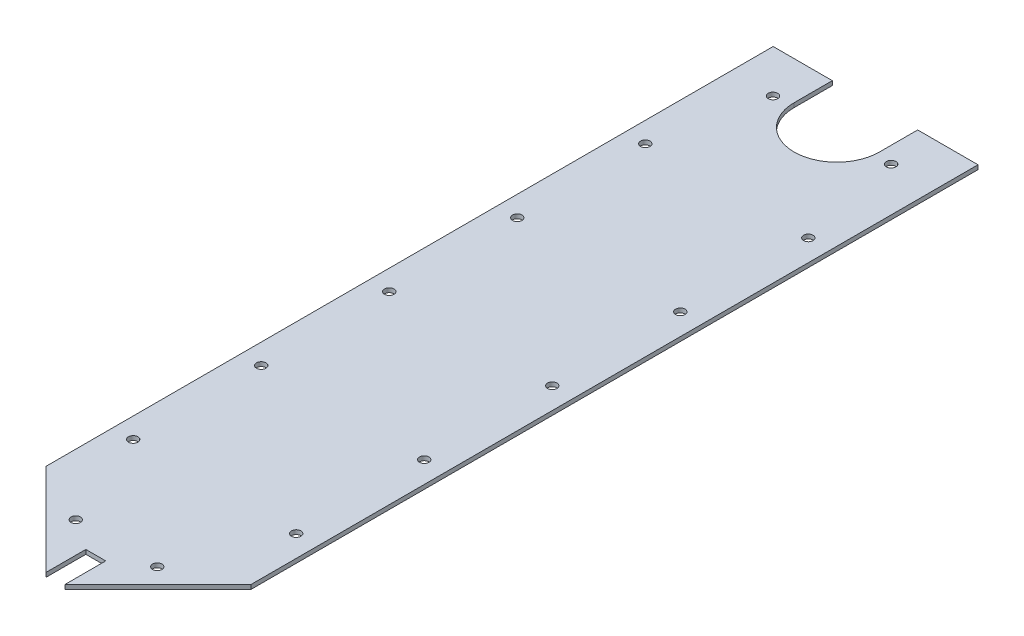
ISO-10303-21;
HEADER;
FILE_DESCRIPTION(('STEP AP214'),'2;1');
FILE_NAME('part.step','',(''),(''),'','','');
FILE_SCHEMA(('AUTOMOTIVE_DESIGN { 1 0 10303 214 1 1 1 1 }'));
ENDSEC;
DATA;
#1=APPLICATION_CONTEXT('core data for automotive mechanical design processes');
#2=APPLICATION_PROTOCOL_DEFINITION('international standard','automotive_design',2000,#1);
#3=PRODUCT_CONTEXT('',#1,'mechanical');
#4=PRODUCT('Part','Part','',(#3));
#5=PRODUCT_RELATED_PRODUCT_CATEGORY('part','',(#4));
#6=PRODUCT_DEFINITION_FORMATION('','',#4);
#7=PRODUCT_DEFINITION_CONTEXT('part definition',#1,'design');
#8=PRODUCT_DEFINITION('design','',#6,#7);
#9=PRODUCT_DEFINITION_SHAPE('','',#8);
#10=(LENGTH_UNIT() NAMED_UNIT(*) SI_UNIT(.MILLI.,.METRE.));
#11=(NAMED_UNIT(*) PLANE_ANGLE_UNIT() SI_UNIT($,.RADIAN.));
#12=(NAMED_UNIT(*) SI_UNIT($,.STERADIAN.) SOLID_ANGLE_UNIT());
#13=UNCERTAINTY_MEASURE_WITH_UNIT(LENGTH_MEASURE(1.E-05),#10,'distance_accuracy_value','');
#14=(GEOMETRIC_REPRESENTATION_CONTEXT(3) GLOBAL_UNCERTAINTY_ASSIGNED_CONTEXT((#13)) GLOBAL_UNIT_ASSIGNED_CONTEXT((#10,
#11,#12)) REPRESENTATION_CONTEXT('',''));
#15=CARTESIAN_POINT('',(0.,0.,0.));
#16=DIRECTION('',(0.,0.,1.));
#17=DIRECTION('',(1.,0.,0.));
#18=AXIS2_PLACEMENT_3D('',#15,#16,#17);
#19=CARTESIAN_POINT('',(0.,3.,-264.934819645511));
#20=DIRECTION('',(0.,-1.,0.));
#21=DIRECTION('',(0.,0.,-1.));
#22=AXIS2_PLACEMENT_3D('',#19,#20,#21);
#23=CYLINDRICAL_SURFACE('',#22,30.0057645191929);
#24=CARTESIAN_POINT('',(0.,0.,-264.934819645511));
#25=DIRECTION('',(0.,-1.,0.));
#26=DIRECTION('',(0.,0.,1.));
#27=AXIS2_PLACEMENT_3D('',#24,#25,#26);
#28=CIRCLE('',#27,30.0057645191929);
#29=CARTESIAN_POINT('',(30.0057645191929,0.,-264.934819645511));
#30=VERTEX_POINT('',#29);
#31=CARTESIAN_POINT('',(-30.0057645191929,0.,-264.934819645511));
#32=VERTEX_POINT('',#31);
#33=EDGE_CURVE('E151',#30,#32,#28,.T.);
#34=ORIENTED_EDGE('',*,*,#33,.T.);
#35=DIRECTION('',(0.,-1.,0.));
#36=VECTOR('',#35,1.);
#37=CARTESIAN_POINT('',(-30.0057645191929,3.,-264.934819645511));
#38=LINE('',#37,#36);
#39=CARTESIAN_POINT('',(-30.0057645191929,3.,-264.934819645511));
#40=VERTEX_POINT('',#39);
#41=EDGE_CURVE('E11',#40,#32,#38,.T.);
#42=ORIENTED_EDGE('',*,*,#41,.F.);
#43=CARTESIAN_POINT('',(0.,3.,-264.934819645511));
#44=DIRECTION('',(0.,-1.,0.));
#45=DIRECTION('',(0.,0.,1.));
#46=AXIS2_PLACEMENT_3D('',#43,#44,#45);
#47=CIRCLE('',#46,30.0057645191929);
#48=CARTESIAN_POINT('',(30.0057645191929,3.,-264.934819645511));
#49=VERTEX_POINT('',#48);
#50=EDGE_CURVE('E170',#49,#40,#47,.T.);
#51=ORIENTED_EDGE('',*,*,#50,.F.);
#52=DIRECTION('',(0.,-1.,0.));
#53=VECTOR('',#52,1.);
#54=CARTESIAN_POINT('',(30.0057645191929,3.,-264.934819645511));
#55=LINE('',#54,#53);
#56=EDGE_CURVE('E147',#49,#30,#55,.T.);
#57=ORIENTED_EDGE('',*,*,#56,.T.);
#58=EDGE_LOOP('',(#34,#42,#51,#57));
#59=FACE_BOUND('',#58,.T.);
#60=ADVANCED_FACE('F41',(#59),#23,.F.);
#61=CARTESIAN_POINT('',(-30.0057645191929,3.,-264.934819645511));
#62=DIRECTION('',(-1.,0.,0.));
#63=DIRECTION('',(0.,0.,1.));
#64=AXIS2_PLACEMENT_3D('',#61,#62,#63);
#65=PLANE('',#64);
#66=DIRECTION('',(0.,0.,-1.));
#67=VECTOR('',#66,1.);
#68=CARTESIAN_POINT('',(-30.0057645191929,0.,-264.934819645511));
#69=LINE('',#68,#67);
#70=CARTESIAN_POINT('',(-30.0057645191929,0.,-291.800526165511));
#71=VERTEX_POINT('',#70);
#72=EDGE_CURVE('E154',#32,#71,#69,.T.);
#73=ORIENTED_EDGE('',*,*,#72,.T.);
#74=DIRECTION('',(0.,-1.,0.));
#75=VECTOR('',#74,1.);
#76=CARTESIAN_POINT('',(-30.0057645191929,3.,-291.800526165511));
#77=LINE('',#76,#75);
#78=CARTESIAN_POINT('',(-30.0057645191929,3.,-291.800526165511));
#79=VERTEX_POINT('',#78);
#80=EDGE_CURVE('E48',#79,#71,#77,.T.);
#81=ORIENTED_EDGE('',*,*,#80,.F.);
#82=DIRECTION('',(0.,0.,-1.));
#83=VECTOR('',#82,1.);
#84=CARTESIAN_POINT('',(-30.0057645191929,3.,-264.934819645511));
#85=LINE('',#84,#83);
#86=EDGE_CURVE('E105',#40,#79,#85,.T.);
#87=ORIENTED_EDGE('',*,*,#86,.F.);
#88=ORIENTED_EDGE('',*,*,#41,.T.);
#89=EDGE_LOOP('',(#73,#81,#87,#88));
#90=FACE_BOUND('',#89,.T.);
#91=ADVANCED_FACE('F354',(#90),#65,.F.);
#92=CARTESIAN_POINT('',(-71.592001124657,3.,-291.800526165511));
#93=DIRECTION('',(0.,0.,1.));
#94=DIRECTION('',(1.,0.,0.));
#95=AXIS2_PLACEMENT_3D('',#92,#93,#94);
#96=PLANE('',#95);
#97=DIRECTION('',(-1.,0.,0.));
#98=VECTOR('',#97,1.);
#99=CARTESIAN_POINT('',(-71.592001124657,0.,-291.800526165511));
#100=LINE('',#99,#98);
#101=CARTESIAN_POINT('',(-71.592001124657,0.,-291.800526165511));
#102=VERTEX_POINT('',#101);
#103=EDGE_CURVE('E157',#71,#102,#100,.T.);
#104=ORIENTED_EDGE('',*,*,#103,.T.);
#105=DIRECTION('',(0.,-1.,0.));
#106=VECTOR('',#105,1.);
#107=CARTESIAN_POINT('',(-71.592001124657,3.,-291.800526165511));
#108=LINE('',#107,#106);
#109=CARTESIAN_POINT('',(-71.592001124657,3.,-291.800526165511));
#110=VERTEX_POINT('',#109);
#111=EDGE_CURVE('E177',#110,#102,#108,.T.);
#112=ORIENTED_EDGE('',*,*,#111,.F.);
#113=DIRECTION('',(-1.,0.,0.));
#114=VECTOR('',#113,1.);
#115=CARTESIAN_POINT('',(-71.592001124657,3.,-291.800526165511));
#116=LINE('',#115,#114);
#117=EDGE_CURVE('E185',#79,#110,#116,.T.);
#118=ORIENTED_EDGE('',*,*,#117,.F.);
#119=ORIENTED_EDGE('',*,*,#80,.T.);
#120=EDGE_LOOP('',(#104,#112,#118,#119));
#121=FACE_BOUND('',#120,.T.);
#122=ADVANCED_FACE('F183',(#121),#96,.F.);
#123=CARTESIAN_POINT('',(-71.592001124657,3.,-291.800526165511));
#124=DIRECTION('',(1.,0.,0.));
#125=DIRECTION('',(0.,0.,-1.));
#126=AXIS2_PLACEMENT_3D('',#123,#124,#125);
#127=PLANE('',#126);
#128=DIRECTION('',(0.,0.,1.));
#129=VECTOR('',#128,1.);
#130=CARTESIAN_POINT('',(-71.592001124657,0.,-291.800526165511));
#131=LINE('',#130,#129);
#132=CARTESIAN_POINT('',(-71.592001124657,0.,219.373421964122));
#133=VERTEX_POINT('',#132);
#134=EDGE_CURVE('E159',#102,#133,#131,.T.);
#135=ORIENTED_EDGE('',*,*,#134,.T.);
#136=DIRECTION('',(0.,-1.,0.));
#137=VECTOR('',#136,1.);
#138=CARTESIAN_POINT('',(-71.592001124657,3.,219.373421964122));
#139=LINE('',#138,#137);
#140=CARTESIAN_POINT('',(-71.592001124657,3.,219.373421964122));
#141=VERTEX_POINT('',#140);
#142=EDGE_CURVE('E174',#141,#133,#139,.T.);
#143=ORIENTED_EDGE('',*,*,#142,.F.);
#144=DIRECTION('',(0.,0.,1.));
#145=VECTOR('',#144,1.);
#146=CARTESIAN_POINT('',(-71.592001124657,3.,-291.800526165511));
#147=LINE('',#146,#145);
#148=EDGE_CURVE('E203',#110,#141,#147,.T.);
#149=ORIENTED_EDGE('',*,*,#148,.F.);
#150=ORIENTED_EDGE('',*,*,#111,.T.);
#151=EDGE_LOOP('',(#135,#143,#149,#150));
#152=FACE_BOUND('',#151,.T.);
#153=ADVANCED_FACE('F194',(#152),#127,.F.);
#154=CARTESIAN_POINT('',(-71.592001124657,3.,219.373421964122));
#155=DIRECTION('',(0.707106781186547,0.,-0.707106781186548));
#156=DIRECTION('',(-0.707106781186548,0.,-0.707106781186547));
#157=AXIS2_PLACEMENT_3D('',#154,#155,#156);
#158=PLANE('',#157);
#159=DIRECTION('',(0.707106781186548,0.,0.707106781186547));
#160=VECTOR('',#159,1.);
#161=CARTESIAN_POINT('',(-71.592001124657,0.,219.373421964122));
#162=LINE('',#161,#160);
#163=CARTESIAN_POINT('',(-7.00000000000002,0.,283.965423088779));
#164=VERTEX_POINT('',#163);
#165=EDGE_CURVE('E161',#133,#164,#162,.T.);
#166=ORIENTED_EDGE('',*,*,#165,.T.);
#167=DIRECTION('',(0.,1.,0.));
#168=VECTOR('',#167,1.);
#169=CARTESIAN_POINT('',(-7.00000000000002,0.,283.965423088779));
#170=LINE('',#169,#168);
#171=CARTESIAN_POINT('',(-7.00000000000002,3.,283.965423088779));
#172=VERTEX_POINT('',#171);
#173=EDGE_CURVE('E155',#164,#172,#170,.T.);
#174=ORIENTED_EDGE('',*,*,#173,.T.);
#175=DIRECTION('',(0.707106781186548,0.,0.707106781186547));
#176=VECTOR('',#175,1.);
#177=CARTESIAN_POINT('',(-71.592001124657,3.,219.373421964122));
#178=LINE('',#177,#176);
#179=EDGE_CURVE('E201',#141,#172,#178,.T.);
#180=ORIENTED_EDGE('',*,*,#179,.F.);
#181=ORIENTED_EDGE('',*,*,#142,.T.);
#182=EDGE_LOOP('',(#166,#174,#180,#181));
#183=FACE_BOUND('',#182,.T.);
#184=ADVANCED_FACE('F198',(#183),#158,.F.);
#185=CARTESIAN_POINT('',(0.408149385343075,3.,291.373572474122));
#186=DIRECTION('',(-0.707106781186547,0.,-0.707106781186548));
#187=DIRECTION('',(-0.707106781186548,0.,0.707106781186547));
#188=AXIS2_PLACEMENT_3D('',#185,#186,#187);
#189=PLANE('',#188);
#190=DIRECTION('',(0.707106781186548,0.,-0.707106781186547));
#191=VECTOR('',#190,1.);
#192=CARTESIAN_POINT('',(0.408149385343075,3.,291.373572474122));
#193=LINE('',#192,#191);
#194=CARTESIAN_POINT('',(6.99999999999997,3.,284.781721859465));
#195=VERTEX_POINT('',#194);
#196=CARTESIAN_POINT('',(72.408299895343,3.,219.373421964122));
#197=VERTEX_POINT('',#196);
#198=EDGE_CURVE('E130',#195,#197,#193,.T.);
#199=ORIENTED_EDGE('',*,*,#198,.F.);
#200=DIRECTION('',(0.,1.,0.));
#201=VECTOR('',#200,1.);
#202=CARTESIAN_POINT('',(6.99999999999997,0.,284.781721859465));
#203=LINE('',#202,#201);
#204=CARTESIAN_POINT('',(6.99999999999997,0.,284.781721859465));
#205=VERTEX_POINT('',#204);
#206=EDGE_CURVE('E210',#205,#195,#203,.T.);
#207=ORIENTED_EDGE('',*,*,#206,.F.);
#208=DIRECTION('',(0.707106781186548,0.,-0.707106781186547));
#209=VECTOR('',#208,1.);
#210=CARTESIAN_POINT('',(0.408149385343075,0.,291.373572474122));
#211=LINE('',#210,#209);
#212=CARTESIAN_POINT('',(72.408299895343,0.,219.373421964122));
#213=VERTEX_POINT('',#212);
#214=EDGE_CURVE('E164',#205,#213,#211,.T.);
#215=ORIENTED_EDGE('',*,*,#214,.T.);
#216=DIRECTION('',(0.,-1.,0.));
#217=VECTOR('',#216,1.);
#218=CARTESIAN_POINT('',(72.408299895343,3.,219.373421964122));
#219=LINE('',#218,#217);
#220=EDGE_CURVE('E142',#197,#213,#219,.T.);
#221=ORIENTED_EDGE('',*,*,#220,.F.);
#222=EDGE_LOOP('',(#199,#207,#215,#221));
#223=FACE_BOUND('',#222,.T.);
#224=ADVANCED_FACE('F372',(#223),#189,.F.);
#225=CARTESIAN_POINT('',(72.408299895343,3.,219.373421964122));
#226=DIRECTION('',(-1.,0.,0.));
#227=DIRECTION('',(0.,0.,1.));
#228=AXIS2_PLACEMENT_3D('',#225,#226,#227);
#229=PLANE('',#228);
#230=DIRECTION('',(0.,0.,-1.));
#231=VECTOR('',#230,1.);
#232=CARTESIAN_POINT('',(72.408299895343,0.,219.373421964122));
#233=LINE('',#232,#231);
#234=CARTESIAN_POINT('',(72.408299895343,0.,-291.800526165512));
#235=VERTEX_POINT('',#234);
#236=EDGE_CURVE('E139',#213,#235,#233,.T.);
#237=ORIENTED_EDGE('',*,*,#236,.T.);
#238=DIRECTION('',(0.,-1.,0.));
#239=VECTOR('',#238,1.);
#240=CARTESIAN_POINT('',(72.408299895343,3.,-291.800526165512));
#241=LINE('',#240,#239);
#242=CARTESIAN_POINT('',(72.408299895343,3.,-291.800526165512));
#243=VERTEX_POINT('',#242);
#244=EDGE_CURVE('E136',#243,#235,#241,.T.);
#245=ORIENTED_EDGE('',*,*,#244,.F.);
#246=DIRECTION('',(0.,0.,-1.));
#247=VECTOR('',#246,1.);
#248=CARTESIAN_POINT('',(72.408299895343,3.,219.373421964122));
#249=LINE('',#248,#247);
#250=EDGE_CURVE('E121',#197,#243,#249,.T.);
#251=ORIENTED_EDGE('',*,*,#250,.F.);
#252=ORIENTED_EDGE('',*,*,#220,.T.);
#253=EDGE_LOOP('',(#237,#245,#251,#252));
#254=FACE_BOUND('',#253,.T.);
#255=ADVANCED_FACE('F137',(#254),#229,.F.);
#256=CARTESIAN_POINT('',(30.0057645191929,3.,-291.800526165512));
#257=DIRECTION('',(0.,0.,1.));
#258=DIRECTION('',(1.,0.,0.));
#259=AXIS2_PLACEMENT_3D('',#256,#257,#258);
#260=PLANE('',#259);
#261=DIRECTION('',(-1.,0.,0.));
#262=VECTOR('',#261,1.);
#263=CARTESIAN_POINT('',(30.0057645191929,0.,-291.800526165512));
#264=LINE('',#263,#262);
#265=CARTESIAN_POINT('',(30.0057645191929,0.,-291.800526165512));
#266=VERTEX_POINT('',#265);
#267=EDGE_CURVE('E167',#235,#266,#264,.T.);
#268=ORIENTED_EDGE('',*,*,#267,.T.);
#269=DIRECTION('',(0.,-1.,0.));
#270=VECTOR('',#269,1.);
#271=CARTESIAN_POINT('',(30.0057645191929,3.,-291.800526165512));
#272=LINE('',#271,#270);
#273=CARTESIAN_POINT('',(30.0057645191929,3.,-291.800526165512));
#274=VERTEX_POINT('',#273);
#275=EDGE_CURVE('E143',#274,#266,#272,.T.);
#276=ORIENTED_EDGE('',*,*,#275,.F.);
#277=DIRECTION('',(-1.,0.,0.));
#278=VECTOR('',#277,1.);
#279=CARTESIAN_POINT('',(30.0057645191929,3.,-291.800526165512));
#280=LINE('',#279,#278);
#281=EDGE_CURVE('E126',#243,#274,#280,.T.);
#282=ORIENTED_EDGE('',*,*,#281,.F.);
#283=ORIENTED_EDGE('',*,*,#244,.T.);
#284=EDGE_LOOP('',(#268,#276,#282,#283));
#285=FACE_BOUND('',#284,.T.);
#286=ADVANCED_FACE('F145',(#285),#260,.F.);
#287=CARTESIAN_POINT('',(30.0057645191929,3.,-264.934819645511));
#288=DIRECTION('',(1.,0.,0.));
#289=DIRECTION('',(0.,0.,-1.));
#290=AXIS2_PLACEMENT_3D('',#287,#288,#289);
#291=PLANE('',#290);
#292=DIRECTION('',(0.,0.,1.));
#293=VECTOR('',#292,1.);
#294=CARTESIAN_POINT('',(30.0057645191929,0.,-264.934819645511));
#295=LINE('',#294,#293);
#296=EDGE_CURVE('E97',#266,#30,#295,.T.);
#297=ORIENTED_EDGE('',*,*,#296,.T.);
#298=ORIENTED_EDGE('',*,*,#56,.F.);
#299=DIRECTION('',(0.,0.,1.));
#300=VECTOR('',#299,1.);
#301=CARTESIAN_POINT('',(30.0057645191929,3.,-264.934819645511));
#302=LINE('',#301,#300);
#303=EDGE_CURVE('E64',#274,#49,#302,.T.);
#304=ORIENTED_EDGE('',*,*,#303,.F.);
#305=ORIENTED_EDGE('',*,*,#275,.T.);
#306=EDGE_LOOP('',(#297,#298,#304,#305));
#307=FACE_BOUND('',#306,.T.);
#308=ADVANCED_FACE('F323',(#307),#291,.F.);
#309=CARTESIAN_POINT('',(0.,3.,-264.934819645511));
#310=DIRECTION('',(0.,1.,0.));
#311=DIRECTION('',(0.,0.,1.));
#312=AXIS2_PLACEMENT_3D('',#309,#310,#311);
#313=PLANE('',#312);
#314=CARTESIAN_POINT('',(-41.537257894065,3.,-261.609819635512));
#315=DIRECTION('',(0.,1.,0.));
#316=DIRECTION('',(0.,0.,-1.));
#317=AXIS2_PLACEMENT_3D('',#314,#315,#316);
#318=CIRCLE('',#317,3.32500000000001);
#319=CARTESIAN_POINT('',(-41.537257894065,3.,-264.934819635512));
#320=VERTEX_POINT('',#319);
#321=EDGE_CURVE('E257',#320,#320,#318,.T.);
#322=ORIENTED_EDGE('',*,*,#321,.F.);
#323=EDGE_LOOP('',(#322));
#324=FACE_BOUND('',#323,.T.);
#325=CARTESIAN_POINT('',(-57.3001505100004,3.,-97.6273018912213));
#326=DIRECTION('',(0.,1.,0.));
#327=DIRECTION('',(0.,0.,1.));
#328=AXIS2_PLACEMENT_3D('',#325,#326,#327);
#329=CIRCLE('',#328,3.32500000000001);
#330=CARTESIAN_POINT('',(-57.3001505100004,3.,-94.3023018912213));
#331=VERTEX_POINT('',#330);
#332=EDGE_CURVE('E268',#331,#331,#329,.T.);
#333=ORIENTED_EDGE('',*,*,#332,.F.);
#334=EDGE_LOOP('',(#333));
#335=FACE_BOUND('',#334,.T.);
#336=CARTESIAN_POINT('',(-57.3001505100007,3.,-187.627301891221));
#337=DIRECTION('',(0.,1.,0.));
#338=DIRECTION('',(0.,0.,1.));
#339=AXIS2_PLACEMENT_3D('',#336,#337,#338);
#340=CIRCLE('',#339,3.325);
#341=CARTESIAN_POINT('',(-57.3001505100007,3.,-184.302301891221));
#342=VERTEX_POINT('',#341);
#343=EDGE_CURVE('E269',#342,#342,#340,.T.);
#344=ORIENTED_EDGE('',*,*,#343,.F.);
#345=EDGE_LOOP('',(#344));
#346=FACE_BOUND('',#345,.T.);
#347=CARTESIAN_POINT('',(57.3001505100007,3.,-187.627301891221));
#348=DIRECTION('',(0.,1.,0.));
#349=DIRECTION('',(0.,0.,-1.));
#350=AXIS2_PLACEMENT_3D('',#347,#348,#349);
#351=CIRCLE('',#350,3.325);
#352=CARTESIAN_POINT('',(57.3001505100007,3.,-190.952301891221));
#353=VERTEX_POINT('',#352);
#354=EDGE_CURVE('E280',#353,#353,#351,.T.);
#355=ORIENTED_EDGE('',*,*,#354,.F.);
#356=EDGE_LOOP('',(#355));
#357=FACE_BOUND('',#356,.T.);
#358=CARTESIAN_POINT('',(41.537257894065,3.,-261.609819635512));
#359=DIRECTION('',(0.,1.,0.));
#360=DIRECTION('',(0.,0.,1.));
#361=AXIS2_PLACEMENT_3D('',#358,#359,#360);
#362=CIRCLE('',#361,3.32500000000001);
#363=CARTESIAN_POINT('',(41.537257894065,3.,-258.284819635512));
#364=VERTEX_POINT('',#363);
#365=EDGE_CURVE('E238',#364,#364,#362,.T.);
#366=ORIENTED_EDGE('',*,*,#365,.F.);
#367=EDGE_LOOP('',(#366));
#368=FACE_BOUND('',#367,.T.);
#369=CARTESIAN_POINT('',(-57.3001505100001,3.,172.372698108779));
#370=DIRECTION('',(0.,1.,0.));
#371=DIRECTION('',(0.,0.,1.));
#372=AXIS2_PLACEMENT_3D('',#369,#370,#371);
#373=CIRCLE('',#372,3.325);
#374=CARTESIAN_POINT('',(-57.3001505100001,3.,175.697698108779));
#375=VERTEX_POINT('',#374);
#376=EDGE_CURVE('E244',#375,#375,#373,.T.);
#377=ORIENTED_EDGE('',*,*,#376,.F.);
#378=EDGE_LOOP('',(#377));
#379=FACE_BOUND('',#378,.T.);
#380=CARTESIAN_POINT('',(-57.3001505100004,3.,82.3726981087787));
#381=DIRECTION('',(0.,1.,0.));
#382=DIRECTION('',(0.,0.,1.));
#383=AXIS2_PLACEMENT_3D('',#380,#381,#382);
#384=CIRCLE('',#383,3.32500000000001);
#385=CARTESIAN_POINT('',(-57.3001505100004,3.,85.6976981087787));
#386=VERTEX_POINT('',#385);
#387=EDGE_CURVE('E245',#386,#386,#384,.T.);
#388=ORIENTED_EDGE('',*,*,#387,.F.);
#389=EDGE_LOOP('',(#388));
#390=FACE_BOUND('',#389,.T.);
#391=CARTESIAN_POINT('',(-57.3001505100001,3.,-7.62730189122128));
#392=DIRECTION('',(0.,1.,0.));
#393=DIRECTION('',(0.,0.,1.));
#394=AXIS2_PLACEMENT_3D('',#391,#392,#393);
#395=CIRCLE('',#394,3.325);
#396=CARTESIAN_POINT('',(-57.3001505100001,3.,-4.30230189122128));
#397=VERTEX_POINT('',#396);
#398=EDGE_CURVE('E256',#397,#397,#395,.T.);
#399=ORIENTED_EDGE('',*,*,#398,.F.);
#400=EDGE_LOOP('',(#399));
#401=FACE_BOUND('',#400,.T.);
#402=CARTESIAN_POINT('',(57.3001505100001,3.,-7.62730189122128));
#403=DIRECTION('',(0.,1.,0.));
#404=DIRECTION('',(0.,0.,-1.));
#405=AXIS2_PLACEMENT_3D('',#402,#403,#404);
#406=CIRCLE('',#405,3.325);
#407=CARTESIAN_POINT('',(57.3001505100001,3.,-10.9523018912213));
#408=VERTEX_POINT('',#407);
#409=EDGE_CURVE('E310',#408,#408,#406,.T.);
#410=ORIENTED_EDGE('',*,*,#409,.F.);
#411=EDGE_LOOP('',(#410));
#412=FACE_BOUND('',#411,.T.);
#413=CARTESIAN_POINT('',(57.3001505100001,3.,172.372698108779));
#414=DIRECTION('',(0.,1.,0.));
#415=DIRECTION('',(0.,0.,-1.));
#416=AXIS2_PLACEMENT_3D('',#413,#414,#415);
#417=CIRCLE('',#416,3.325);
#418=CARTESIAN_POINT('',(57.3001505100001,3.,169.047698108779));
#419=VERTEX_POINT('',#418);
#420=EDGE_CURVE('E300',#419,#419,#417,.T.);
#421=ORIENTED_EDGE('',*,*,#420,.F.);
#422=EDGE_LOOP('',(#421));
#423=FACE_BOUND('',#422,.T.);
#424=CARTESIAN_POINT('',(57.3001505100004,3.,82.3726981087787));
#425=DIRECTION('',(0.,1.,0.));
#426=DIRECTION('',(0.,0.,-1.));
#427=AXIS2_PLACEMENT_3D('',#424,#425,#426);
#428=CIRCLE('',#427,3.32500000000001);
#429=CARTESIAN_POINT('',(57.3001505100004,3.,79.0476981087787));
#430=VERTEX_POINT('',#429);
#431=EDGE_CURVE('E299',#430,#430,#428,.T.);
#432=ORIENTED_EDGE('',*,*,#431,.F.);
#433=EDGE_LOOP('',(#432));
#434=FACE_BOUND('',#433,.T.);
#435=CARTESIAN_POINT('',(57.3001505100004,3.,-97.6273018912213));
#436=DIRECTION('',(0.,1.,0.));
#437=DIRECTION('',(0.,0.,-1.));
#438=AXIS2_PLACEMENT_3D('',#435,#436,#437);
#439=CIRCLE('',#438,3.32499999999942);
#440=CARTESIAN_POINT('',(57.3001505100004,3.,-100.952301891221));
#441=VERTEX_POINT('',#440);
#442=EDGE_CURVE('E281',#441,#441,#439,.T.);
#443=ORIENTED_EDGE('',*,*,#442,.F.);
#444=EDGE_LOOP('',(#443));
#445=FACE_BOUND('',#444,.T.);
#446=CARTESIAN_POINT('',(28.65007526,3.,241.415105098779));
#447=DIRECTION('',(0.,1.,0.));
#448=DIRECTION('',(0.,0.,-1.));
#449=AXIS2_PLACEMENT_3D('',#446,#447,#448);
#450=CIRCLE('',#449,3.32500000000001);
#451=CARTESIAN_POINT('',(28.65007526,3.,238.090105098779));
#452=VERTEX_POINT('',#451);
#453=EDGE_CURVE('E292',#452,#452,#450,.T.);
#454=ORIENTED_EDGE('',*,*,#453,.F.);
#455=EDGE_LOOP('',(#454));
#456=FACE_BOUND('',#455,.T.);
#457=CARTESIAN_POINT('',(-28.65007526,3.,241.415105098779));
#458=DIRECTION('',(0.,1.,0.));
#459=DIRECTION('',(0.,0.,1.));
#460=AXIS2_PLACEMENT_3D('',#457,#458,#459);
#461=CIRCLE('',#460,3.32500000000001);
#462=CARTESIAN_POINT('',(-28.65007526,3.,244.740105098779));
#463=VERTEX_POINT('',#462);
#464=EDGE_CURVE('E235',#463,#463,#461,.T.);
#465=ORIENTED_EDGE('',*,*,#464,.F.);
#466=EDGE_LOOP('',(#465));
#467=FACE_BOUND('',#466,.T.);
#468=DIRECTION('',(0.,0.,1.));
#469=VECTOR('',#468,1.);
#470=CARTESIAN_POINT('',(-7.00000000000002,3.,283.965423088779));
#471=LINE('',#470,#469);
#472=CARTESIAN_POINT('',(-7.00000000000001,3.,255.965423088779));
#473=VERTEX_POINT('',#472);
#474=EDGE_CURVE('E220',#473,#172,#471,.T.);
#475=ORIENTED_EDGE('',*,*,#474,.F.);
#476=DIRECTION('',(-1.,0.,0.));
#477=VECTOR('',#476,1.);
#478=CARTESIAN_POINT('',(-7.00000000000001,3.,255.965423088779));
#479=LINE('',#478,#477);
#480=CARTESIAN_POINT('',(6.99999999999999,3.,255.965423088779));
#481=VERTEX_POINT('',#480);
#482=EDGE_CURVE('E224',#481,#473,#479,.T.);
#483=ORIENTED_EDGE('',*,*,#482,.F.);
#484=DIRECTION('',(0.,0.,-1.));
#485=VECTOR('',#484,1.);
#486=CARTESIAN_POINT('',(6.99999999999999,3.,255.965423088779));
#487=LINE('',#486,#485);
#488=EDGE_CURVE('E227',#195,#481,#487,.T.);
#489=ORIENTED_EDGE('',*,*,#488,.F.);
#490=ORIENTED_EDGE('',*,*,#198,.T.);
#491=ORIENTED_EDGE('',*,*,#250,.T.);
#492=ORIENTED_EDGE('',*,*,#281,.T.);
#493=ORIENTED_EDGE('',*,*,#303,.T.);
#494=ORIENTED_EDGE('',*,*,#50,.T.);
#495=ORIENTED_EDGE('',*,*,#86,.T.);
#496=ORIENTED_EDGE('',*,*,#117,.T.);
#497=ORIENTED_EDGE('',*,*,#148,.T.);
#498=ORIENTED_EDGE('',*,*,#179,.T.);
#499=EDGE_LOOP('',(#475,#483,#489,#490,#491,#492,#493,#494,#495,#496,#497,#498));
#500=FACE_BOUND('',#499,.T.);
#501=ADVANCED_FACE('F124',(#324,#335,#346,#357,#368,#379,#390,#401,#412,#423,#434,#445,#456,
#467,#500),#313,.T.);
#502=CARTESIAN_POINT('',(0.,0.,-264.934819645511));
#503=DIRECTION('',(0.,1.,0.));
#504=DIRECTION('',(0.,0.,1.));
#505=AXIS2_PLACEMENT_3D('',#502,#503,#504);
#506=PLANE('',#505);
#507=CARTESIAN_POINT('',(-41.537257894065,0.,-261.609819635512));
#508=DIRECTION('',(0.,1.,0.));
#509=DIRECTION('',(0.,0.,-1.));
#510=AXIS2_PLACEMENT_3D('',#507,#508,#509);
#511=CIRCLE('',#510,3.32500000000001);
#512=CARTESIAN_POINT('',(-41.537257894065,0.,-264.934819635512));
#513=VERTEX_POINT('',#512);
#514=EDGE_CURVE('E272',#513,#513,#511,.T.);
#515=ORIENTED_EDGE('',*,*,#514,.T.);
#516=EDGE_LOOP('',(#515));
#517=FACE_BOUND('',#516,.T.);
#518=CARTESIAN_POINT('',(-57.3001505100004,0.,-97.6273018912213));
#519=DIRECTION('',(0.,1.,0.));
#520=DIRECTION('',(0.,0.,1.));
#521=AXIS2_PLACEMENT_3D('',#518,#519,#520);
#522=CIRCLE('',#521,3.32500000000001);
#523=CARTESIAN_POINT('',(-57.3001505100004,0.,-94.3023018912213));
#524=VERTEX_POINT('',#523);
#525=EDGE_CURVE('E265',#524,#524,#522,.T.);
#526=ORIENTED_EDGE('',*,*,#525,.T.);
#527=EDGE_LOOP('',(#526));
#528=FACE_BOUND('',#527,.T.);
#529=CARTESIAN_POINT('',(-57.3001505100007,0.,-187.627301891221));
#530=DIRECTION('',(0.,1.,0.));
#531=DIRECTION('',(0.,0.,1.));
#532=AXIS2_PLACEMENT_3D('',#529,#530,#531);
#533=CIRCLE('',#532,3.325);
#534=CARTESIAN_POINT('',(-57.3001505100007,0.,-184.302301891221));
#535=VERTEX_POINT('',#534);
#536=EDGE_CURVE('E284',#535,#535,#533,.T.);
#537=ORIENTED_EDGE('',*,*,#536,.T.);
#538=EDGE_LOOP('',(#537));
#539=FACE_BOUND('',#538,.T.);
#540=CARTESIAN_POINT('',(57.3001505100007,0.,-187.627301891221));
#541=DIRECTION('',(0.,1.,0.));
#542=DIRECTION('',(0.,0.,-1.));
#543=AXIS2_PLACEMENT_3D('',#540,#541,#542);
#544=CIRCLE('',#543,3.325);
#545=CARTESIAN_POINT('',(57.3001505100007,0.,-190.952301891221));
#546=VERTEX_POINT('',#545);
#547=EDGE_CURVE('E277',#546,#546,#544,.T.);
#548=ORIENTED_EDGE('',*,*,#547,.T.);
#549=EDGE_LOOP('',(#548));
#550=FACE_BOUND('',#549,.T.);
#551=CARTESIAN_POINT('',(41.537257894065,0.,-261.609819635512));
#552=DIRECTION('',(0.,1.,0.));
#553=DIRECTION('',(0.,0.,1.));
#554=AXIS2_PLACEMENT_3D('',#551,#552,#553);
#555=CIRCLE('',#554,3.32500000000001);
#556=CARTESIAN_POINT('',(41.537257894065,0.,-258.284819635512));
#557=VERTEX_POINT('',#556);
#558=EDGE_CURVE('E248',#557,#557,#555,.T.);
#559=ORIENTED_EDGE('',*,*,#558,.T.);
#560=EDGE_LOOP('',(#559));
#561=FACE_BOUND('',#560,.T.);
#562=CARTESIAN_POINT('',(-57.3001505100001,0.,172.372698108779));
#563=DIRECTION('',(0.,1.,0.));
#564=DIRECTION('',(0.,0.,1.));
#565=AXIS2_PLACEMENT_3D('',#562,#563,#564);
#566=CIRCLE('',#565,3.325);
#567=CARTESIAN_POINT('',(-57.3001505100001,0.,175.697698108779));
#568=VERTEX_POINT('',#567);
#569=EDGE_CURVE('E241',#568,#568,#566,.T.);
#570=ORIENTED_EDGE('',*,*,#569,.T.);
#571=EDGE_LOOP('',(#570));
#572=FACE_BOUND('',#571,.T.);
#573=CARTESIAN_POINT('',(-57.3001505100004,0.,82.3726981087787));
#574=DIRECTION('',(0.,1.,0.));
#575=DIRECTION('',(0.,0.,1.));
#576=AXIS2_PLACEMENT_3D('',#573,#574,#575);
#577=CIRCLE('',#576,3.32500000000001);
#578=CARTESIAN_POINT('',(-57.3001505100004,0.,85.6976981087787));
#579=VERTEX_POINT('',#578);
#580=EDGE_CURVE('E260',#579,#579,#577,.T.);
#581=ORIENTED_EDGE('',*,*,#580,.T.);
#582=EDGE_LOOP('',(#581));
#583=FACE_BOUND('',#582,.T.);
#584=CARTESIAN_POINT('',(-57.3001505100001,0.,-7.62730189122128));
#585=DIRECTION('',(0.,1.,0.));
#586=DIRECTION('',(0.,0.,1.));
#587=AXIS2_PLACEMENT_3D('',#584,#585,#586);
#588=CIRCLE('',#587,3.325);
#589=CARTESIAN_POINT('',(-57.3001505100001,0.,-4.30230189122128));
#590=VERTEX_POINT('',#589);
#591=EDGE_CURVE('E253',#590,#590,#588,.T.);
#592=ORIENTED_EDGE('',*,*,#591,.T.);
#593=EDGE_LOOP('',(#592));
#594=FACE_BOUND('',#593,.T.);
#595=CARTESIAN_POINT('',(57.3001505100001,0.,-7.62730189122128));
#596=DIRECTION('',(0.,1.,0.));
#597=DIRECTION('',(0.,0.,-1.));
#598=AXIS2_PLACEMENT_3D('',#595,#596,#597);
#599=CIRCLE('',#598,3.325);
#600=CARTESIAN_POINT('',(57.3001505100001,0.,-10.9523018912213));
#601=VERTEX_POINT('',#600);
#602=EDGE_CURVE('E295',#601,#601,#599,.T.);
#603=ORIENTED_EDGE('',*,*,#602,.T.);
#604=EDGE_LOOP('',(#603));
#605=FACE_BOUND('',#604,.T.);
#606=CARTESIAN_POINT('',(57.3001505100001,0.,172.372698108779));
#607=DIRECTION('',(0.,1.,0.));
#608=DIRECTION('',(0.,0.,-1.));
#609=AXIS2_PLACEMENT_3D('',#606,#607,#608);
#610=CIRCLE('',#609,3.325);
#611=CARTESIAN_POINT('',(57.3001505100001,0.,169.047698108779));
#612=VERTEX_POINT('',#611);
#613=EDGE_CURVE('E313',#612,#612,#610,.T.);
#614=ORIENTED_EDGE('',*,*,#613,.T.);
#615=EDGE_LOOP('',(#614));
#616=FACE_BOUND('',#615,.T.);
#617=CARTESIAN_POINT('',(57.3001505100004,0.,82.3726981087787));
#618=DIRECTION('',(0.,1.,0.));
#619=DIRECTION('',(0.,0.,-1.));
#620=AXIS2_PLACEMENT_3D('',#617,#618,#619);
#621=CIRCLE('',#620,3.32500000000001);
#622=CARTESIAN_POINT('',(57.3001505100004,0.,79.0476981087787));
#623=VERTEX_POINT('',#622);
#624=EDGE_CURVE('E296',#623,#623,#621,.T.);
#625=ORIENTED_EDGE('',*,*,#624,.T.);
#626=EDGE_LOOP('',(#625));
#627=FACE_BOUND('',#626,.T.);
#628=CARTESIAN_POINT('',(57.3001505100004,0.,-97.6273018912213));
#629=DIRECTION('',(0.,1.,0.));
#630=DIRECTION('',(0.,0.,-1.));
#631=AXIS2_PLACEMENT_3D('',#628,#629,#630);
#632=CIRCLE('',#631,3.32499999999942);
#633=CARTESIAN_POINT('',(57.3001505100004,0.,-100.952301891221));
#634=VERTEX_POINT('',#633);
#635=EDGE_CURVE('E303',#634,#634,#632,.T.);
#636=ORIENTED_EDGE('',*,*,#635,.T.);
#637=EDGE_LOOP('',(#636));
#638=FACE_BOUND('',#637,.T.);
#639=CARTESIAN_POINT('',(28.65007526,0.,241.415105098779));
#640=DIRECTION('',(0.,1.,0.));
#641=DIRECTION('',(0.,0.,-1.));
#642=AXIS2_PLACEMENT_3D('',#639,#640,#641);
#643=CIRCLE('',#642,3.32500000000001);
#644=CARTESIAN_POINT('',(28.65007526,0.,238.090105098779));
#645=VERTEX_POINT('',#644);
#646=EDGE_CURVE('E289',#645,#645,#643,.T.);
#647=ORIENTED_EDGE('',*,*,#646,.T.);
#648=EDGE_LOOP('',(#647));
#649=FACE_BOUND('',#648,.T.);
#650=CARTESIAN_POINT('',(-28.65007526,0.,241.415105098779));
#651=DIRECTION('',(0.,1.,0.));
#652=DIRECTION('',(0.,0.,1.));
#653=AXIS2_PLACEMENT_3D('',#650,#651,#652);
#654=CIRCLE('',#653,3.32500000000001);
#655=CARTESIAN_POINT('',(-28.65007526,0.,244.740105098779));
#656=VERTEX_POINT('',#655);
#657=EDGE_CURVE('E230',#656,#656,#654,.T.);
#658=ORIENTED_EDGE('',*,*,#657,.T.);
#659=EDGE_LOOP('',(#658));
#660=FACE_BOUND('',#659,.T.);
#661=DIRECTION('',(-1.,0.,0.));
#662=VECTOR('',#661,1.);
#663=CARTESIAN_POINT('',(-7.00000000000001,0.,255.965423088779));
#664=LINE('',#663,#662);
#665=CARTESIAN_POINT('',(6.99999999999999,0.,255.965423088779));
#666=VERTEX_POINT('',#665);
#667=CARTESIAN_POINT('',(-7.00000000000001,0.,255.965423088779));
#668=VERTEX_POINT('',#667);
#669=EDGE_CURVE('E55',#666,#668,#664,.T.);
#670=ORIENTED_EDGE('',*,*,#669,.T.);
#671=DIRECTION('',(0.,0.,1.));
#672=VECTOR('',#671,1.);
#673=CARTESIAN_POINT('',(-7.00000000000002,0.,283.965423088779));
#674=LINE('',#673,#672);
#675=EDGE_CURVE('E214',#668,#164,#674,.T.);
#676=ORIENTED_EDGE('',*,*,#675,.T.);
#677=ORIENTED_EDGE('',*,*,#165,.F.);
#678=ORIENTED_EDGE('',*,*,#134,.F.);
#679=ORIENTED_EDGE('',*,*,#103,.F.);
#680=ORIENTED_EDGE('',*,*,#72,.F.);
#681=ORIENTED_EDGE('',*,*,#33,.F.);
#682=ORIENTED_EDGE('',*,*,#296,.F.);
#683=ORIENTED_EDGE('',*,*,#267,.F.);
#684=ORIENTED_EDGE('',*,*,#236,.F.);
#685=ORIENTED_EDGE('',*,*,#214,.F.);
#686=DIRECTION('',(0.,0.,-1.));
#687=VECTOR('',#686,1.);
#688=CARTESIAN_POINT('',(6.99999999999999,0.,255.965423088779));
#689=LINE('',#688,#687);
#690=EDGE_CURVE('E223',#205,#666,#689,.T.);
#691=ORIENTED_EDGE('',*,*,#690,.T.);
#692=EDGE_LOOP('',(#670,#676,#677,#678,#679,#680,#681,#682,#683,#684,#685,#691));
#693=FACE_BOUND('',#692,.T.);
#694=ADVANCED_FACE('F188',(#517,#528,#539,#550,#561,#572,#583,#594,#605,#616,#627,#638,#649,
#660,#693),#506,.F.);
#695=CARTESIAN_POINT('',(-7.00000000000002,0.,283.965423088779));
#696=DIRECTION('',(-1.,0.,0.));
#697=DIRECTION('',(0.,0.,1.));
#698=AXIS2_PLACEMENT_3D('',#695,#696,#697);
#699=PLANE('',#698);
#700=ORIENTED_EDGE('',*,*,#474,.T.);
#701=ORIENTED_EDGE('',*,*,#173,.F.);
#702=ORIENTED_EDGE('',*,*,#675,.F.);
#703=DIRECTION('',(0.,1.,0.));
#704=VECTOR('',#703,1.);
#705=CARTESIAN_POINT('',(-7.00000000000001,0.,255.965423088779));
#706=LINE('',#705,#704);
#707=EDGE_CURVE('E216',#668,#473,#706,.T.);
#708=ORIENTED_EDGE('',*,*,#707,.T.);
#709=EDGE_LOOP('',(#700,#701,#702,#708));
#710=FACE_BOUND('',#709,.T.);
#711=ADVANCED_FACE('F432',(#710),#699,.F.);
#712=CARTESIAN_POINT('',(-7.00000000000001,0.,255.965423088779));
#713=DIRECTION('',(0.,0.,-1.));
#714=DIRECTION('',(-1.,0.,0.));
#715=AXIS2_PLACEMENT_3D('',#712,#713,#714);
#716=PLANE('',#715);
#717=ORIENTED_EDGE('',*,*,#482,.T.);
#718=ORIENTED_EDGE('',*,*,#707,.F.);
#719=ORIENTED_EDGE('',*,*,#669,.F.);
#720=DIRECTION('',(0.,1.,0.));
#721=VECTOR('',#720,1.);
#722=CARTESIAN_POINT('',(6.99999999999999,0.,255.965423088779));
#723=LINE('',#722,#721);
#724=EDGE_CURVE('E213',#666,#481,#723,.T.);
#725=ORIENTED_EDGE('',*,*,#724,.T.);
#726=EDGE_LOOP('',(#717,#718,#719,#725));
#727=FACE_BOUND('',#726,.T.);
#728=ADVANCED_FACE('F347',(#727),#716,.F.);
#729=CARTESIAN_POINT('',(6.99999999999999,0.,255.965423088779));
#730=DIRECTION('',(1.,0.,0.));
#731=DIRECTION('',(0.,0.,-1.));
#732=AXIS2_PLACEMENT_3D('',#729,#730,#731);
#733=PLANE('',#732);
#734=ORIENTED_EDGE('',*,*,#488,.T.);
#735=ORIENTED_EDGE('',*,*,#724,.F.);
#736=ORIENTED_EDGE('',*,*,#690,.F.);
#737=ORIENTED_EDGE('',*,*,#206,.T.);
#738=EDGE_LOOP('',(#734,#735,#736,#737));
#739=FACE_BOUND('',#738,.T.);
#740=ADVANCED_FACE('F337',(#739),#733,.F.);
#741=CARTESIAN_POINT('',(-28.65007526,0.,241.415105098779));
#742=DIRECTION('',(0.,1.,0.));
#743=DIRECTION('',(0.,0.,1.));
#744=AXIS2_PLACEMENT_3D('',#741,#742,#743);
#745=CYLINDRICAL_SURFACE('',#744,3.32500000000001);
#746=ORIENTED_EDGE('',*,*,#657,.F.);
#747=EDGE_LOOP('',(#746));
#748=FACE_BOUND('',#747,.T.);
#749=ORIENTED_EDGE('',*,*,#464,.T.);
#750=EDGE_LOOP('',(#749));
#751=FACE_BOUND('',#750,.T.);
#752=ADVANCED_FACE('F334',(#748,#751),#745,.F.);
#753=CARTESIAN_POINT('',(28.65007526,0.,241.415105098779));
#754=DIRECTION('',(0.,1.,0.));
#755=DIRECTION('',(0.,0.,1.));
#756=AXIS2_PLACEMENT_3D('',#753,#754,#755);
#757=CYLINDRICAL_SURFACE('',#756,3.32500000000001);
#758=ORIENTED_EDGE('',*,*,#646,.F.);
#759=EDGE_LOOP('',(#758));
#760=FACE_BOUND('',#759,.T.);
#761=ORIENTED_EDGE('',*,*,#453,.T.);
#762=EDGE_LOOP('',(#761));
#763=FACE_BOUND('',#762,.T.);
#764=ADVANCED_FACE('F336',(#760,#763),#757,.F.);
#765=CARTESIAN_POINT('',(57.3001505100004,0.,-97.6273018912213));
#766=DIRECTION('',(0.,1.,0.));
#767=DIRECTION('',(0.,0.,1.));
#768=AXIS2_PLACEMENT_3D('',#765,#766,#767);
#769=CYLINDRICAL_SURFACE('',#768,3.32499999999942);
#770=ORIENTED_EDGE('',*,*,#635,.F.);
#771=EDGE_LOOP('',(#770));
#772=FACE_BOUND('',#771,.T.);
#773=ORIENTED_EDGE('',*,*,#442,.T.);
#774=EDGE_LOOP('',(#773));
#775=FACE_BOUND('',#774,.T.);
#776=ADVANCED_FACE('F344',(#772,#775),#769,.F.);
#777=CARTESIAN_POINT('',(57.3001505100004,0.,82.3726981087787));
#778=DIRECTION('',(0.,1.,0.));
#779=DIRECTION('',(0.,0.,1.));
#780=AXIS2_PLACEMENT_3D('',#777,#778,#779);
#781=CYLINDRICAL_SURFACE('',#780,3.32500000000001);
#782=ORIENTED_EDGE('',*,*,#624,.F.);
#783=EDGE_LOOP('',(#782));
#784=FACE_BOUND('',#783,.T.);
#785=ORIENTED_EDGE('',*,*,#431,.T.);
#786=EDGE_LOOP('',(#785));
#787=FACE_BOUND('',#786,.T.);
#788=ADVANCED_FACE('F478',(#784,#787),#781,.F.);
#789=CARTESIAN_POINT('',(57.3001505100001,0.,172.372698108779));
#790=DIRECTION('',(0.,1.,0.));
#791=DIRECTION('',(0.,0.,1.));
#792=AXIS2_PLACEMENT_3D('',#789,#790,#791);
#793=CYLINDRICAL_SURFACE('',#792,3.325);
#794=ORIENTED_EDGE('',*,*,#613,.F.);
#795=EDGE_LOOP('',(#794));
#796=FACE_BOUND('',#795,.T.);
#797=ORIENTED_EDGE('',*,*,#420,.T.);
#798=EDGE_LOOP('',(#797));
#799=FACE_BOUND('',#798,.T.);
#800=ADVANCED_FACE('F319',(#796,#799),#793,.F.);
#801=CARTESIAN_POINT('',(57.3001505100001,0.,-7.62730189122128));
#802=DIRECTION('',(0.,1.,0.));
#803=DIRECTION('',(0.,0.,1.));
#804=AXIS2_PLACEMENT_3D('',#801,#802,#803);
#805=CYLINDRICAL_SURFACE('',#804,3.325);
#806=ORIENTED_EDGE('',*,*,#602,.F.);
#807=EDGE_LOOP('',(#806));
#808=FACE_BOUND('',#807,.T.);
#809=ORIENTED_EDGE('',*,*,#409,.T.);
#810=EDGE_LOOP('',(#809));
#811=FACE_BOUND('',#810,.T.);
#812=ADVANCED_FACE('F499',(#808,#811),#805,.F.);
#813=CARTESIAN_POINT('',(-57.3001505100001,0.,-7.62730189122128));
#814=DIRECTION('',(0.,1.,0.));
#815=DIRECTION('',(0.,0.,1.));
#816=AXIS2_PLACEMENT_3D('',#813,#814,#815);
#817=CYLINDRICAL_SURFACE('',#816,3.325);
#818=ORIENTED_EDGE('',*,*,#591,.F.);
#819=EDGE_LOOP('',(#818));
#820=FACE_BOUND('',#819,.T.);
#821=ORIENTED_EDGE('',*,*,#398,.T.);
#822=EDGE_LOOP('',(#821));
#823=FACE_BOUND('',#822,.T.);
#824=ADVANCED_FACE('F510',(#820,#823),#817,.F.);
#825=CARTESIAN_POINT('',(-57.3001505100004,0.,82.3726981087787));
#826=DIRECTION('',(0.,1.,0.));
#827=DIRECTION('',(0.,0.,1.));
#828=AXIS2_PLACEMENT_3D('',#825,#826,#827);
#829=CYLINDRICAL_SURFACE('',#828,3.32500000000001);
#830=ORIENTED_EDGE('',*,*,#580,.F.);
#831=EDGE_LOOP('',(#830));
#832=FACE_BOUND('',#831,.T.);
#833=ORIENTED_EDGE('',*,*,#387,.T.);
#834=EDGE_LOOP('',(#833));
#835=FACE_BOUND('',#834,.T.);
#836=ADVANCED_FACE('F521',(#832,#835),#829,.F.);
#837=CARTESIAN_POINT('',(-57.3001505100001,0.,172.372698108779));
#838=DIRECTION('',(0.,1.,0.));
#839=DIRECTION('',(0.,0.,1.));
#840=AXIS2_PLACEMENT_3D('',#837,#838,#839);
#841=CYLINDRICAL_SURFACE('',#840,3.325);
#842=ORIENTED_EDGE('',*,*,#569,.F.);
#843=EDGE_LOOP('',(#842));
#844=FACE_BOUND('',#843,.T.);
#845=ORIENTED_EDGE('',*,*,#376,.T.);
#846=EDGE_LOOP('',(#845));
#847=FACE_BOUND('',#846,.T.);
#848=ADVANCED_FACE('F532',(#844,#847),#841,.F.);
#849=CARTESIAN_POINT('',(41.537257894065,0.,-261.609819635512));
#850=DIRECTION('',(0.,1.,0.));
#851=DIRECTION('',(0.,0.,1.));
#852=AXIS2_PLACEMENT_3D('',#849,#850,#851);
#853=CYLINDRICAL_SURFACE('',#852,3.32500000000001);
#854=ORIENTED_EDGE('',*,*,#558,.F.);
#855=EDGE_LOOP('',(#854));
#856=FACE_BOUND('',#855,.T.);
#857=ORIENTED_EDGE('',*,*,#365,.T.);
#858=EDGE_LOOP('',(#857));
#859=FACE_BOUND('',#858,.T.);
#860=ADVANCED_FACE('F543',(#856,#859),#853,.F.);
#861=CARTESIAN_POINT('',(57.3001505100007,0.,-187.627301891221));
#862=DIRECTION('',(0.,1.,0.));
#863=DIRECTION('',(0.,0.,1.));
#864=AXIS2_PLACEMENT_3D('',#861,#862,#863);
#865=CYLINDRICAL_SURFACE('',#864,3.325);
#866=ORIENTED_EDGE('',*,*,#547,.F.);
#867=EDGE_LOOP('',(#866));
#868=FACE_BOUND('',#867,.T.);
#869=ORIENTED_EDGE('',*,*,#354,.T.);
#870=EDGE_LOOP('',(#869));
#871=FACE_BOUND('',#870,.T.);
#872=ADVANCED_FACE('F553',(#868,#871),#865,.F.);
#873=CARTESIAN_POINT('',(-57.3001505100007,0.,-187.627301891221));
#874=DIRECTION('',(0.,1.,0.));
#875=DIRECTION('',(0.,0.,1.));
#876=AXIS2_PLACEMENT_3D('',#873,#874,#875);
#877=CYLINDRICAL_SURFACE('',#876,3.325);
#878=ORIENTED_EDGE('',*,*,#536,.F.);
#879=EDGE_LOOP('',(#878));
#880=FACE_BOUND('',#879,.T.);
#881=ORIENTED_EDGE('',*,*,#343,.T.);
#882=EDGE_LOOP('',(#881));
#883=FACE_BOUND('',#882,.T.);
#884=ADVANCED_FACE('F564',(#880,#883),#877,.F.);
#885=CARTESIAN_POINT('',(-57.3001505100004,0.,-97.6273018912213));
#886=DIRECTION('',(0.,1.,0.));
#887=DIRECTION('',(0.,0.,1.));
#888=AXIS2_PLACEMENT_3D('',#885,#886,#887);
#889=CYLINDRICAL_SURFACE('',#888,3.32500000000001);
#890=ORIENTED_EDGE('',*,*,#525,.F.);
#891=EDGE_LOOP('',(#890));
#892=FACE_BOUND('',#891,.T.);
#893=ORIENTED_EDGE('',*,*,#332,.T.);
#894=EDGE_LOOP('',(#893));
#895=FACE_BOUND('',#894,.T.);
#896=ADVANCED_FACE('F575',(#892,#895),#889,.F.);
#897=CARTESIAN_POINT('',(-41.537257894065,0.,-261.609819635512));
#898=DIRECTION('',(0.,1.,0.));
#899=DIRECTION('',(0.,0.,1.));
#900=AXIS2_PLACEMENT_3D('',#897,#898,#899);
#901=CYLINDRICAL_SURFACE('',#900,3.32500000000001);
#902=ORIENTED_EDGE('',*,*,#514,.F.);
#903=EDGE_LOOP('',(#902));
#904=FACE_BOUND('',#903,.T.);
#905=ORIENTED_EDGE('',*,*,#321,.T.);
#906=EDGE_LOOP('',(#905));
#907=FACE_BOUND('',#906,.T.);
#908=ADVANCED_FACE('F586',(#904,#907),#901,.F.);
#909=CLOSED_SHELL('',(#60,#91,#122,#153,#184,#224,#255,#286,#308,#501,#694,#711,#728,#740,#752,
#764,#776,#788,#800,#812,#824,#836,#848,#860,#872,#884,#896,#908));
#910=MANIFOLD_SOLID_BREP('B2',#909);
#911=ADVANCED_BREP_SHAPE_REPRESENTATION('',(#18,#910),#14);
#912=SHAPE_DEFINITION_REPRESENTATION(#9,#911);
ENDSEC;
END-ISO-10303-21;
